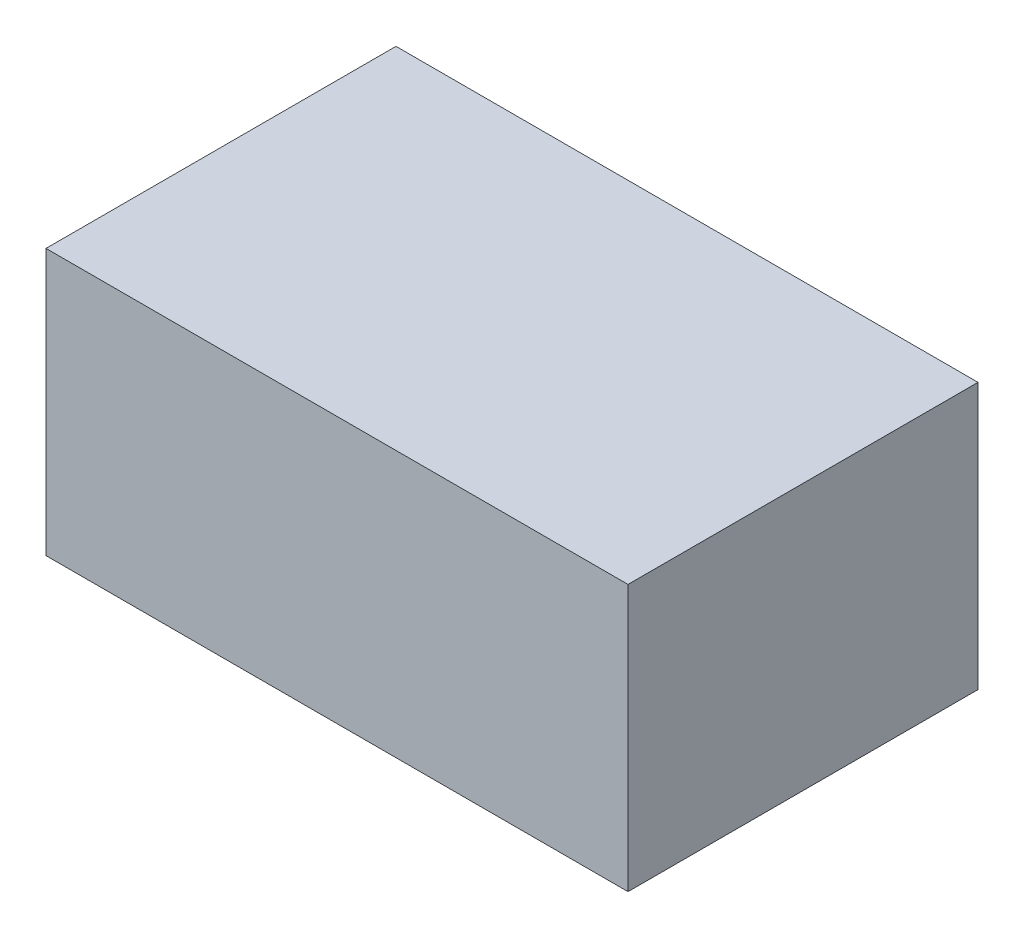
ISO-10303-21;
HEADER;
FILE_DESCRIPTION(('STEP AP214'),'2;1');
FILE_NAME('part.step','',(''),(''),'','','');
FILE_SCHEMA(('AUTOMOTIVE_DESIGN { 1 0 10303 214 1 1 1 1 }'));
ENDSEC;
DATA;
#1=APPLICATION_CONTEXT('core data for automotive mechanical design processes');
#2=APPLICATION_PROTOCOL_DEFINITION('international standard','automotive_design',2000,#1);
#3=PRODUCT_CONTEXT('',#1,'mechanical');
#4=PRODUCT('Part','Part','',(#3));
#5=PRODUCT_RELATED_PRODUCT_CATEGORY('part','',(#4));
#6=PRODUCT_DEFINITION_FORMATION('','',#4);
#7=PRODUCT_DEFINITION_CONTEXT('part definition',#1,'design');
#8=PRODUCT_DEFINITION('design','',#6,#7);
#9=PRODUCT_DEFINITION_SHAPE('','',#8);
#10=(LENGTH_UNIT() NAMED_UNIT(*) SI_UNIT(.MILLI.,.METRE.));
#11=(NAMED_UNIT(*) PLANE_ANGLE_UNIT() SI_UNIT($,.RADIAN.));
#12=(NAMED_UNIT(*) SI_UNIT($,.STERADIAN.) SOLID_ANGLE_UNIT());
#13=UNCERTAINTY_MEASURE_WITH_UNIT(LENGTH_MEASURE(1.E-05),#10,'distance_accuracy_value','');
#14=(GEOMETRIC_REPRESENTATION_CONTEXT(3) GLOBAL_UNCERTAINTY_ASSIGNED_CONTEXT((#13)) GLOBAL_UNIT_ASSIGNED_CONTEXT((#10,
#11,#12)) REPRESENTATION_CONTEXT('',''));
#15=CARTESIAN_POINT('',(0.,0.,0.));
#16=DIRECTION('',(0.,0.,1.));
#17=DIRECTION('',(1.,0.,0.));
#18=AXIS2_PLACEMENT_3D('',#15,#16,#17);
#19=CARTESIAN_POINT('',(22.2,-10.15,26.7));
#20=DIRECTION('',(-1.,0.,0.));
#21=DIRECTION('',(0.,0.,1.));
#22=AXIS2_PLACEMENT_3D('',#19,#20,#21);
#23=PLANE('',#22);
#24=DIRECTION('',(0.,1.,0.));
#25=VECTOR('',#24,1.);
#26=CARTESIAN_POINT('',(22.2,-10.15,0.));
#27=LINE('',#26,#25);
#28=CARTESIAN_POINT('',(22.2,-10.15,0.));
#29=VERTEX_POINT('',#28);
#30=CARTESIAN_POINT('',(22.2,10.15,0.));
#31=VERTEX_POINT('',#30);
#32=EDGE_CURVE('E112',#29,#31,#27,.T.);
#33=ORIENTED_EDGE('',*,*,#32,.T.);
#34=DIRECTION('',(0.,0.,-1.));
#35=VECTOR('',#34,1.);
#36=CARTESIAN_POINT('',(22.2,10.15,26.7));
#37=LINE('',#36,#35);
#38=CARTESIAN_POINT('',(22.2,10.15,26.7));
#39=VERTEX_POINT('',#38);
#40=EDGE_CURVE('E11',#39,#31,#37,.T.);
#41=ORIENTED_EDGE('',*,*,#40,.F.);
#42=DIRECTION('',(0.,1.,0.));
#43=VECTOR('',#42,1.);
#44=CARTESIAN_POINT('',(22.2,-10.15,26.7));
#45=LINE('',#44,#43);
#46=CARTESIAN_POINT('',(22.2,-10.15,26.7));
#47=VERTEX_POINT('',#46);
#48=EDGE_CURVE('E95',#47,#39,#45,.T.);
#49=ORIENTED_EDGE('',*,*,#48,.F.);
#50=DIRECTION('',(0.,0.,-1.));
#51=VECTOR('',#50,1.);
#52=CARTESIAN_POINT('',(22.2,-10.15,26.7));
#53=LINE('',#52,#51);
#54=EDGE_CURVE('E108',#47,#29,#53,.T.);
#55=ORIENTED_EDGE('',*,*,#54,.T.);
#56=EDGE_LOOP('',(#33,#41,#49,#55));
#57=FACE_BOUND('',#56,.T.);
#58=ADVANCED_FACE('F43',(#57),#23,.F.);
#59=CARTESIAN_POINT('',(-22.2,10.15,26.7));
#60=DIRECTION('',(0.,-1.,0.));
#61=DIRECTION('',(0.,0.,-1.));
#62=AXIS2_PLACEMENT_3D('',#59,#60,#61);
#63=PLANE('',#62);
#64=DIRECTION('',(-1.,0.,0.));
#65=VECTOR('',#64,1.);
#66=CARTESIAN_POINT('',(-22.2,10.15,0.));
#67=LINE('',#66,#65);
#68=CARTESIAN_POINT('',(-22.2,10.15,0.));
#69=VERTEX_POINT('',#68);
#70=EDGE_CURVE('E100',#31,#69,#67,.T.);
#71=ORIENTED_EDGE('',*,*,#70,.T.);
#72=DIRECTION('',(0.,0.,-1.));
#73=VECTOR('',#72,1.);
#74=CARTESIAN_POINT('',(-22.2,10.15,26.7));
#75=LINE('',#74,#73);
#76=CARTESIAN_POINT('',(-22.2,10.15,26.7));
#77=VERTEX_POINT('',#76);
#78=EDGE_CURVE('E52',#77,#69,#75,.T.);
#79=ORIENTED_EDGE('',*,*,#78,.F.);
#80=DIRECTION('',(-1.,0.,0.));
#81=VECTOR('',#80,1.);
#82=CARTESIAN_POINT('',(-22.2,10.15,26.7));
#83=LINE('',#82,#81);
#84=EDGE_CURVE('E90',#39,#77,#83,.T.);
#85=ORIENTED_EDGE('',*,*,#84,.F.);
#86=ORIENTED_EDGE('',*,*,#40,.T.);
#87=EDGE_LOOP('',(#71,#79,#85,#86));
#88=FACE_BOUND('',#87,.T.);
#89=ADVANCED_FACE('F99',(#88),#63,.F.);
#90=CARTESIAN_POINT('',(-22.2,-10.15,26.7));
#91=DIRECTION('',(1.,0.,0.));
#92=DIRECTION('',(0.,0.,-1.));
#93=AXIS2_PLACEMENT_3D('',#90,#91,#92);
#94=PLANE('',#93);
#95=DIRECTION('',(0.,-1.,0.));
#96=VECTOR('',#95,1.);
#97=CARTESIAN_POINT('',(-22.2,-10.15,0.));
#98=LINE('',#97,#96);
#99=CARTESIAN_POINT('',(-22.2,-10.15,0.));
#100=VERTEX_POINT('',#99);
#101=EDGE_CURVE('E77',#69,#100,#98,.T.);
#102=ORIENTED_EDGE('',*,*,#101,.T.);
#103=DIRECTION('',(0.,0.,-1.));
#104=VECTOR('',#103,1.);
#105=CARTESIAN_POINT('',(-22.2,-10.15,26.7));
#106=LINE('',#105,#104);
#107=CARTESIAN_POINT('',(-22.2,-10.15,26.7));
#108=VERTEX_POINT('',#107);
#109=EDGE_CURVE('E102',#108,#100,#106,.T.);
#110=ORIENTED_EDGE('',*,*,#109,.F.);
#111=DIRECTION('',(0.,-1.,0.));
#112=VECTOR('',#111,1.);
#113=CARTESIAN_POINT('',(-22.2,-10.15,26.7));
#114=LINE('',#113,#112);
#115=EDGE_CURVE('E93',#77,#108,#114,.T.);
#116=ORIENTED_EDGE('',*,*,#115,.F.);
#117=ORIENTED_EDGE('',*,*,#78,.T.);
#118=EDGE_LOOP('',(#102,#110,#116,#117));
#119=FACE_BOUND('',#118,.T.);
#120=ADVANCED_FACE('F103',(#119),#94,.F.);
#121=CARTESIAN_POINT('',(-22.2,-10.15,26.7));
#122=DIRECTION('',(0.,1.,0.));
#123=DIRECTION('',(0.,0.,1.));
#124=AXIS2_PLACEMENT_3D('',#121,#122,#123);
#125=PLANE('',#124);
#126=DIRECTION('',(1.,0.,0.));
#127=VECTOR('',#126,1.);
#128=CARTESIAN_POINT('',(-22.2,-10.15,0.));
#129=LINE('',#128,#127);
#130=EDGE_CURVE('E83',#100,#29,#129,.T.);
#131=ORIENTED_EDGE('',*,*,#130,.T.);
#132=ORIENTED_EDGE('',*,*,#54,.F.);
#133=DIRECTION('',(1.,0.,0.));
#134=VECTOR('',#133,1.);
#135=CARTESIAN_POINT('',(-22.2,-10.15,26.7));
#136=LINE('',#135,#134);
#137=EDGE_CURVE('E60',#108,#47,#136,.T.);
#138=ORIENTED_EDGE('',*,*,#137,.F.);
#139=ORIENTED_EDGE('',*,*,#109,.T.);
#140=EDGE_LOOP('',(#131,#132,#138,#139));
#141=FACE_BOUND('',#140,.T.);
#142=ADVANCED_FACE('F124',(#141),#125,.F.);
#143=CARTESIAN_POINT('',(0.,0.,26.7));
#144=DIRECTION('',(0.,0.,-1.));
#145=DIRECTION('',(-1.,0.,0.));
#146=AXIS2_PLACEMENT_3D('',#143,#144,#145);
#147=PLANE('',#146);
#148=ORIENTED_EDGE('',*,*,#48,.T.);
#149=ORIENTED_EDGE('',*,*,#84,.T.);
#150=ORIENTED_EDGE('',*,*,#115,.T.);
#151=ORIENTED_EDGE('',*,*,#137,.T.);
#152=EDGE_LOOP('',(#148,#149,#150,#151));
#153=FACE_BOUND('',#152,.T.);
#154=ADVANCED_FACE('F91',(#153),#147,.F.);
#155=CARTESIAN_POINT('',(0.,0.,0.));
#156=DIRECTION('',(0.,0.,-1.));
#157=DIRECTION('',(-1.,0.,0.));
#158=AXIS2_PLACEMENT_3D('',#155,#156,#157);
#159=PLANE('',#158);
#160=ORIENTED_EDGE('',*,*,#32,.F.);
#161=ORIENTED_EDGE('',*,*,#130,.F.);
#162=ORIENTED_EDGE('',*,*,#101,.F.);
#163=ORIENTED_EDGE('',*,*,#70,.F.);
#164=EDGE_LOOP('',(#160,#161,#162,#163));
#165=FACE_BOUND('',#164,.T.);
#166=ADVANCED_FACE('F127',(#165),#159,.T.);
#167=CLOSED_SHELL('',(#58,#89,#120,#142,#154,#166));
#168=MANIFOLD_SOLID_BREP('B2',#167);
#169=ADVANCED_BREP_SHAPE_REPRESENTATION('',(#18,#168),#14);
#170=SHAPE_DEFINITION_REPRESENTATION(#9,#169);
ENDSEC;
END-ISO-10303-21;
